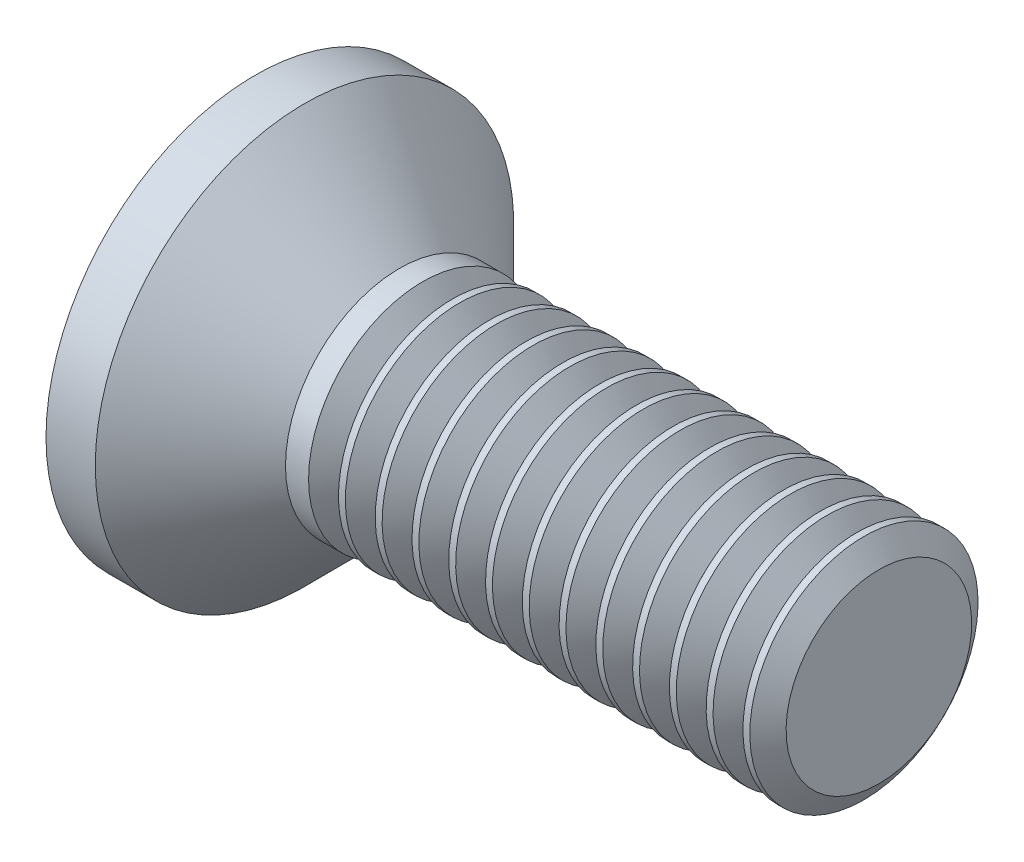
ISO-10303-21;
HEADER;
FILE_DESCRIPTION(('STEP AP214'),'2;1');
FILE_NAME('part.step','',(''),(''),'','','');
FILE_SCHEMA(('AUTOMOTIVE_DESIGN { 1 0 10303 214 1 1 1 1 }'));
ENDSEC;
DATA;
#1=APPLICATION_CONTEXT('core data for automotive mechanical design processes');
#2=APPLICATION_PROTOCOL_DEFINITION('international standard','automotive_design',2000,#1);
#3=PRODUCT_CONTEXT('',#1,'mechanical');
#4=PRODUCT('Part','Part','',(#3));
#5=PRODUCT_RELATED_PRODUCT_CATEGORY('part','',(#4));
#6=PRODUCT_DEFINITION_FORMATION('','',#4);
#7=PRODUCT_DEFINITION_CONTEXT('part definition',#1,'design');
#8=PRODUCT_DEFINITION('design','',#6,#7);
#9=PRODUCT_DEFINITION_SHAPE('','',#8);
#10=(LENGTH_UNIT() NAMED_UNIT(*) SI_UNIT(.MILLI.,.METRE.));
#11=(NAMED_UNIT(*) PLANE_ANGLE_UNIT() SI_UNIT($,.RADIAN.));
#12=(NAMED_UNIT(*) SI_UNIT($,.STERADIAN.) SOLID_ANGLE_UNIT());
#13=UNCERTAINTY_MEASURE_WITH_UNIT(LENGTH_MEASURE(1.E-05),#10,'distance_accuracy_value','');
#14=(GEOMETRIC_REPRESENTATION_CONTEXT(3) GLOBAL_UNCERTAINTY_ASSIGNED_CONTEXT((#13)) GLOBAL_UNIT_ASSIGNED_CONTEXT((#10,
#11,#12)) REPRESENTATION_CONTEXT('',''));
#15=CARTESIAN_POINT('',(0.,0.,0.));
#16=DIRECTION('',(0.,0.,1.));
#17=DIRECTION('',(1.,0.,0.));
#18=AXIS2_PLACEMENT_3D('',#15,#16,#17);
#19=CARTESIAN_POINT('',(7.4,0.,0.));
#20=DIRECTION('',(-1.,0.,0.));
#21=DIRECTION('',(0.,-1.,0.));
#22=AXIS2_PLACEMENT_3D('',#19,#20,#21);
#23=SPHERICAL_SURFACE('',#22,7.4);
#24=CARTESIAN_POINT('',(0.529956332016513,0.,0.));
#25=DIRECTION('',(-1.,0.,0.));
#26=DIRECTION('',(0.,0.,1.));
#27=AXIS2_PLACEMENT_3D('',#24,#25,#26);
#28=CIRCLE('',#27,2.75);
#29=CARTESIAN_POINT('',(0.529956332016513,0.,2.75));
#30=VERTEX_POINT('',#29);
#31=EDGE_CURVE('E158',#30,#30,#28,.T.);
#32=ORIENTED_EDGE('',*,*,#31,.T.);
#33=EDGE_LOOP('',(#32));
#34=FACE_BOUND('',#33,.T.);
#35=CARTESIAN_POINT('',(7.37844022875731,0.,-0.242092852990189));
#36=DIRECTION('',(-0.0887047329662643,0.,-0.996057965356125));
#37=DIRECTION('',(-0.996057965356125,0.,0.0887047329662643));
#38=AXIS2_PLACEMENT_3D('',#35,#36,#37);
#39=CIRCLE('',#38,7.39600745178066);
#40=CARTESIAN_POINT('',(0.185890101969758,1.59933099603895,0.398445409373938));
#41=VERTEX_POINT('',#40);
#42=CARTESIAN_POINT('',(0.0230796751196916,0.41294462120715,0.412944621207152));
#43=VERTEX_POINT('',#42);
#44=EDGE_CURVE('E129',#41,#43,#39,.F.);
#45=ORIENTED_EDGE('',*,*,#44,.T.);
#46=CARTESIAN_POINT('',(7.37844022875731,-0.24209285299019,0.));
#47=DIRECTION('',(-0.0887047329662644,-0.996057965356125,0.));
#48=DIRECTION('',(0.996057965356125,-0.0887047329662644,0.));
#49=AXIS2_PLACEMENT_3D('',#46,#47,#48);
#50=CIRCLE('',#49,7.39600745178066);
#51=CARTESIAN_POINT('',(0.185890101969758,0.398445409373932,1.59933099603895));
#52=VERTEX_POINT('',#51);
#53=EDGE_CURVE('E111',#43,#52,#50,.F.);
#54=ORIENTED_EDGE('',*,*,#53,.T.);
#55=CARTESIAN_POINT('',(5.99170841267437,0.,-2.16946737088841));
#56=DIRECTION('',(0.544482116778557,0.,0.838772450971264));
#57=DIRECTION('',(0.838772450971265,0.,-0.544482116778557));
#58=AXIS2_PLACEMENT_3D('',#55,#56,#57);
#59=CIRCLE('',#58,6.93326230080172);
#60=CARTESIAN_POINT('',(0.185890101969758,-0.398445409373943,1.59933099603894));
#61=VERTEX_POINT('',#60);
#62=EDGE_CURVE('E122',#61,#52,#59,.F.);
#63=ORIENTED_EDGE('',*,*,#62,.F.);
#64=CARTESIAN_POINT('',(7.37844022875731,0.242092852990189,0.));
#65=DIRECTION('',(-0.0887047329662643,0.996057965356125,0.));
#66=DIRECTION('',(-0.996057965356125,-0.0887047329662643,0.));
#67=AXIS2_PLACEMENT_3D('',#64,#65,#66);
#68=CIRCLE('',#67,7.39600745178066);
#69=CARTESIAN_POINT('',(0.0230796751196933,-0.412944621207153,0.412944621207151));
#70=VERTEX_POINT('',#69);
#71=EDGE_CURVE('E188',#61,#70,#68,.F.);
#72=ORIENTED_EDGE('',*,*,#71,.T.);
#73=CARTESIAN_POINT('',(0.185890101969757,-1.59933099603895,0.398445409373938));
#74=VERTEX_POINT('',#73);
#75=EDGE_CURVE('E163',#70,#74,#39,.F.);
#76=ORIENTED_EDGE('',*,*,#75,.T.);
#77=CARTESIAN_POINT('',(5.99170841267437,2.1694673708884,0.));
#78=DIRECTION('',(0.544482116778557,-0.838772450971264,0.));
#79=DIRECTION('',(0.838772450971265,0.544482116778557,0.));
#80=AXIS2_PLACEMENT_3D('',#77,#78,#79);
#81=CIRCLE('',#80,6.93326230080172);
#82=CARTESIAN_POINT('',(0.185890101969757,-1.59933099603895,-0.398445409373938));
#83=VERTEX_POINT('',#82);
#84=EDGE_CURVE('E161',#83,#74,#81,.F.);
#85=ORIENTED_EDGE('',*,*,#84,.F.);
#86=CARTESIAN_POINT('',(7.37844022875731,0.,0.24209285299019));
#87=DIRECTION('',(-0.0887047329662644,0.,0.996057965356125));
#88=DIRECTION('',(0.996057965356125,0.,0.0887047329662644));
#89=AXIS2_PLACEMENT_3D('',#86,#87,#88);
#90=CIRCLE('',#89,7.39600745178066);
#91=CARTESIAN_POINT('',(0.0230796751196933,-0.41294462120715,-0.412944621207152));
#92=VERTEX_POINT('',#91);
#93=EDGE_CURVE('E165',#83,#92,#90,.F.);
#94=ORIENTED_EDGE('',*,*,#93,.T.);
#95=CARTESIAN_POINT('',(0.185890101969757,-0.398445409373932,-1.59933099603895));
#96=VERTEX_POINT('',#95);
#97=EDGE_CURVE('E192',#92,#96,#68,.F.);
#98=ORIENTED_EDGE('',*,*,#97,.T.);
#99=CARTESIAN_POINT('',(5.99170841267437,0.,2.16946737088841));
#100=DIRECTION('',(0.544482116778557,0.,-0.838772450971264));
#101=DIRECTION('',(-0.838772450971265,0.,-0.544482116778557));
#102=AXIS2_PLACEMENT_3D('',#99,#100,#101);
#103=CIRCLE('',#102,6.93326230080172);
#104=CARTESIAN_POINT('',(0.185890101969757,0.398445409373944,-1.59933099603894));
#105=VERTEX_POINT('',#104);
#106=EDGE_CURVE('E123',#105,#96,#103,.F.);
#107=ORIENTED_EDGE('',*,*,#106,.F.);
#108=CARTESIAN_POINT('',(0.0230796751196933,0.412944621207153,-0.412944621207152));
#109=VERTEX_POINT('',#108);
#110=EDGE_CURVE('E148',#105,#109,#50,.F.);
#111=ORIENTED_EDGE('',*,*,#110,.T.);
#112=CARTESIAN_POINT('',(0.185890101969758,1.59933099603895,-0.398445409373938));
#113=VERTEX_POINT('',#112);
#114=EDGE_CURVE('E62',#109,#113,#90,.F.);
#115=ORIENTED_EDGE('',*,*,#114,.T.);
#116=CARTESIAN_POINT('',(5.99170841267437,-2.1694673708884,0.));
#117=DIRECTION('',(0.544482116778557,0.838772450971264,0.));
#118=DIRECTION('',(-0.838772450971265,0.544482116778557,0.));
#119=AXIS2_PLACEMENT_3D('',#116,#117,#118);
#120=CIRCLE('',#119,6.93326230080172);
#121=EDGE_CURVE('E47',#41,#113,#120,.F.);
#122=ORIENTED_EDGE('',*,*,#121,.F.);
#123=EDGE_LOOP('',(#45,#54,#63,#72,#76,#85,#94,#98,#107,#111,#115,#122));
#124=FACE_BOUND('',#123,.T.);
#125=ADVANCED_FACE('F39',(#34,#124),#23,.T.);
#126=CARTESIAN_POINT('',(2.64965289256198,0.,-0.17903305785124));
#127=DIRECTION('',(-0.0887047329662644,0.,0.996057965356125));
#128=DIRECTION('',(0.996057965356125,0.,0.0887047329662644));
#129=AXIS2_PLACEMENT_3D('',#126,#127,#128);
#130=PLANE('',#129);
#131=ORIENTED_EDGE('',*,*,#114,.F.);
#132=DIRECTION('',(0.992162185069946,-0.0883577911596629,0.0883577911596626));
#133=VECTOR('',#132,1.);
#134=CARTESIAN_POINT('',(2.66534787197402,0.177635328998022,-0.177635328998022));
#135=LINE('',#134,#133);
#136=CARTESIAN_POINT('',(2.33,0.207500000000001,-0.207499999999999));
#137=VERTEX_POINT('',#136);
#138=EDGE_CURVE('E170',#109,#137,#135,.T.);
#139=ORIENTED_EDGE('',*,*,#138,.T.);
#140=DIRECTION('',(0.836442139156631,-0.542969414366697,0.0744900188304725));
#141=VECTOR('',#140,1.);
#142=CARTESIAN_POINT('',(0.,1.72,-0.415));
#143=LINE('',#142,#141);
#144=EDGE_CURVE('E132',#113,#137,#143,.T.);
#145=ORIENTED_EDGE('',*,*,#144,.F.);
#146=EDGE_LOOP('',(#131,#139,#145));
#147=FACE_BOUND('',#146,.T.);
#148=ADVANCED_FACE('F169',(#147),#130,.T.);
#149=DIRECTION('',(0.836442139156631,0.542969414366697,0.0744900188304725));
#150=VECTOR('',#149,1.);
#151=CARTESIAN_POINT('',(0.,-1.72,-0.415));
#152=LINE('',#151,#150);
#153=CARTESIAN_POINT('',(2.33,-0.2075,-0.2075));
#154=VERTEX_POINT('',#153);
#155=EDGE_CURVE('E54',#83,#154,#152,.T.);
#156=ORIENTED_EDGE('',*,*,#155,.T.);
#157=DIRECTION('',(-0.992162185069946,-0.0883577911596622,-0.0883577911596626));
#158=VECTOR('',#157,1.);
#159=CARTESIAN_POINT('',(2.66534787197402,-0.177635328998021,-0.177635328998022));
#160=LINE('',#159,#158);
#161=EDGE_CURVE('E190',#154,#92,#160,.T.);
#162=ORIENTED_EDGE('',*,*,#161,.T.);
#163=ORIENTED_EDGE('',*,*,#93,.F.);
#164=EDGE_LOOP('',(#156,#162,#163));
#165=FACE_BOUND('',#164,.T.);
#166=ADVANCED_FACE('F341',(#165),#130,.T.);
#167=CARTESIAN_POINT('',(2.64965289256198,0.,0.17903305785124));
#168=DIRECTION('',(-0.0887047329662643,0.,-0.996057965356125));
#169=DIRECTION('',(-0.996057965356125,0.,0.0887047329662643));
#170=AXIS2_PLACEMENT_3D('',#167,#168,#169);
#171=PLANE('',#170);
#172=DIRECTION('',(0.836442139156631,-0.542969414366697,-0.0744900188304725));
#173=VECTOR('',#172,1.);
#174=CARTESIAN_POINT('',(0.,1.72,0.415));
#175=LINE('',#174,#173);
#176=CARTESIAN_POINT('',(2.33,0.207499999999999,0.207500000000001));
#177=VERTEX_POINT('',#176);
#178=EDGE_CURVE('E127',#41,#177,#175,.T.);
#179=ORIENTED_EDGE('',*,*,#178,.T.);
#180=DIRECTION('',(-0.992162185069947,0.0883577911596623,0.0883577911596626));
#181=VECTOR('',#180,1.);
#182=CARTESIAN_POINT('',(2.66534787197402,0.177635328998021,0.177635328998022));
#183=LINE('',#182,#181);
#184=EDGE_CURVE('E11',#177,#43,#183,.T.);
#185=ORIENTED_EDGE('',*,*,#184,.T.);
#186=ORIENTED_EDGE('',*,*,#44,.F.);
#187=EDGE_LOOP('',(#179,#185,#186));
#188=FACE_BOUND('',#187,.T.);
#189=ADVANCED_FACE('F128',(#188),#171,.T.);
#190=ORIENTED_EDGE('',*,*,#75,.F.);
#191=DIRECTION('',(0.992162185069946,0.0883577911596628,-0.0883577911596625));
#192=VECTOR('',#191,1.);
#193=CARTESIAN_POINT('',(2.66534787197402,-0.177635328998022,0.177635328998022));
#194=LINE('',#193,#192);
#195=CARTESIAN_POINT('',(2.33,-0.2075,0.2075));
#196=VERTEX_POINT('',#195);
#197=EDGE_CURVE('E185',#70,#196,#194,.T.);
#198=ORIENTED_EDGE('',*,*,#197,.T.);
#199=DIRECTION('',(0.836442139156631,0.542969414366697,-0.0744900188304724));
#200=VECTOR('',#199,1.);
#201=CARTESIAN_POINT('',(0.,-1.72,0.415));
#202=LINE('',#201,#200);
#203=EDGE_CURVE('E176',#74,#196,#202,.T.);
#204=ORIENTED_EDGE('',*,*,#203,.F.);
#205=EDGE_LOOP('',(#190,#198,#204));
#206=FACE_BOUND('',#205,.T.);
#207=ADVANCED_FACE('F184',(#206),#171,.T.);
#208=CARTESIAN_POINT('',(-15.875,0.,0.));
#209=DIRECTION('',(-1.,0.,0.));
#210=DIRECTION('',(0.,0.,1.));
#211=AXIS2_PLACEMENT_3D('',#208,#209,#210);
#212=CYLINDRICAL_SURFACE('',#211,2.75);
#213=ORIENTED_EDGE('',*,*,#31,.F.);
#214=EDGE_LOOP('',(#213));
#215=FACE_BOUND('',#214,.T.);
#216=CARTESIAN_POINT('',(1.1776690729551,0.,0.));
#217=DIRECTION('',(-1.,0.,0.));
#218=DIRECTION('',(0.,0.,1.));
#219=AXIS2_PLACEMENT_3D('',#216,#217,#218);
#220=CIRCLE('',#219,2.75);
#221=CARTESIAN_POINT('',(1.1776690729551,0.,2.75));
#222=VERTEX_POINT('',#221);
#223=EDGE_CURVE('E155',#222,#222,#220,.T.);
#224=ORIENTED_EDGE('',*,*,#223,.T.);
#225=EDGE_LOOP('',(#224));
#226=FACE_BOUND('',#225,.T.);
#227=ADVANCED_FACE('F344',(#215,#226),#212,.T.);
#228=CARTESIAN_POINT('',(2.42766907295509,0.,0.));
#229=DIRECTION('',(-1.,0.,0.));
#230=DIRECTION('',(0.,0.,1.));
#231=AXIS2_PLACEMENT_3D('',#228,#229,#230);
#232=CONICAL_SURFACE('',#231,1.5,0.785398163397451);
#233=ORIENTED_EDGE('',*,*,#223,.F.);
#234=EDGE_LOOP('',(#233));
#235=FACE_BOUND('',#234,.T.);
#236=CARTESIAN_POINT('',(2.42766907295509,0.,0.));
#237=DIRECTION('',(-1.,0.,0.));
#238=DIRECTION('',(0.,0.,1.));
#239=AXIS2_PLACEMENT_3D('',#236,#237,#238);
#240=CIRCLE('',#239,1.5);
#241=CARTESIAN_POINT('',(2.42766907295509,0.,1.5));
#242=VERTEX_POINT('',#241);
#243=EDGE_CURVE('E152',#242,#242,#240,.T.);
#244=ORIENTED_EDGE('',*,*,#243,.T.);
#245=EDGE_LOOP('',(#244));
#246=FACE_BOUND('',#245,.T.);
#247=ADVANCED_FACE('F347',(#235,#246),#232,.T.);
#248=CARTESIAN_POINT('',(-15.875,0.,0.));
#249=DIRECTION('',(-1.,0.,0.));
#250=DIRECTION('',(0.,0.,1.));
#251=AXIS2_PLACEMENT_3D('',#248,#249,#250);
#252=CYLINDRICAL_SURFACE('',#251,1.5);
#253=CARTESIAN_POINT('',(2.73126085848727,0.,0.));
#254=DIRECTION('',(-1.,0.,0.));
#255=DIRECTION('',(0.,-1.,0.));
#256=AXIS2_PLACEMENT_3D('',#253,#254,#255);
#257=CIRCLE('',#256,1.5);
#258=CARTESIAN_POINT('',(2.73126085848727,-1.5,0.));
#259=VERTEX_POINT('',#258);
#260=EDGE_CURVE('E214',#259,#259,#257,.T.);
#261=ORIENTED_EDGE('',*,*,#260,.T.);
#262=EDGE_LOOP('',(#261));
#263=FACE_BOUND('',#262,.T.);
#264=ORIENTED_EDGE('',*,*,#243,.F.);
#265=EDGE_LOOP('',(#264));
#266=FACE_BOUND('',#265,.T.);
#267=ADVANCED_FACE('F350',(#263,#266),#252,.T.);
#268=CARTESIAN_POINT('',(2.33,0.2075,-0.2075));
#269=DIRECTION('',(-1.,0.,0.));
#270=DIRECTION('',(0.,0.,1.));
#271=AXIS2_PLACEMENT_3D('',#268,#269,#270);
#272=PLANE('',#271);
#273=DIRECTION('',(0.,1.,0.));
#274=VECTOR('',#273,1.);
#275=CARTESIAN_POINT('',(2.33,-0.2075,-0.2075));
#276=LINE('',#275,#274);
#277=EDGE_CURVE('E145',#154,#137,#276,.T.);
#278=ORIENTED_EDGE('',*,*,#277,.F.);
#279=DIRECTION('',(0.,0.,1.));
#280=VECTOR('',#279,1.);
#281=CARTESIAN_POINT('',(2.33,-0.2075,-0.2075));
#282=LINE('',#281,#280);
#283=EDGE_CURVE('E140',#154,#196,#282,.T.);
#284=ORIENTED_EDGE('',*,*,#283,.T.);
#285=DIRECTION('',(0.,-1.,0.));
#286=VECTOR('',#285,1.);
#287=CARTESIAN_POINT('',(2.33,0.2075,0.2075));
#288=LINE('',#287,#286);
#289=EDGE_CURVE('E119',#177,#196,#288,.T.);
#290=ORIENTED_EDGE('',*,*,#289,.F.);
#291=DIRECTION('',(0.,0.,-1.));
#292=VECTOR('',#291,1.);
#293=CARTESIAN_POINT('',(2.33,0.2075,0.2075));
#294=LINE('',#293,#292);
#295=EDGE_CURVE('E139',#177,#137,#294,.T.);
#296=ORIENTED_EDGE('',*,*,#295,.T.);
#297=EDGE_LOOP('',(#278,#284,#290,#296));
#298=FACE_BOUND('',#297,.T.);
#299=ADVANCED_FACE('F138',(#298),#272,.T.);
#300=CARTESIAN_POINT('',(2.33,0.2075,0.2075));
#301=DIRECTION('',(0.544482116778557,0.838772450971264,0.));
#302=DIRECTION('',(-0.838772450971265,0.544482116778557,0.));
#303=AXIS2_PLACEMENT_3D('',#300,#301,#302);
#304=PLANE('',#303);
#305=ORIENTED_EDGE('',*,*,#121,.T.);
#306=ORIENTED_EDGE('',*,*,#144,.T.);
#307=ORIENTED_EDGE('',*,*,#295,.F.);
#308=ORIENTED_EDGE('',*,*,#178,.F.);
#309=EDGE_LOOP('',(#305,#306,#307,#308));
#310=FACE_BOUND('',#309,.T.);
#311=ADVANCED_FACE('F143',(#310),#304,.F.);
#312=CARTESIAN_POINT('',(2.33,-0.2075,-0.2075));
#313=DIRECTION('',(0.544482116778557,-0.838772450971264,0.));
#314=DIRECTION('',(0.838772450971265,0.544482116778557,0.));
#315=AXIS2_PLACEMENT_3D('',#312,#313,#314);
#316=PLANE('',#315);
#317=ORIENTED_EDGE('',*,*,#84,.T.);
#318=ORIENTED_EDGE('',*,*,#203,.T.);
#319=ORIENTED_EDGE('',*,*,#283,.F.);
#320=ORIENTED_EDGE('',*,*,#155,.F.);
#321=EDGE_LOOP('',(#317,#318,#319,#320));
#322=FACE_BOUND('',#321,.T.);
#323=ADVANCED_FACE('F179',(#322),#316,.F.);
#324=CARTESIAN_POINT('',(2.64965289256198,0.17903305785124,0.));
#325=DIRECTION('',(-0.0887047329662644,-0.996057965356125,0.));
#326=DIRECTION('',(0.996057965356125,-0.0887047329662644,0.));
#327=AXIS2_PLACEMENT_3D('',#324,#325,#326);
#328=PLANE('',#327);
#329=ORIENTED_EDGE('',*,*,#184,.F.);
#330=DIRECTION('',(0.836442139156631,-0.0744900188304706,-0.542969414366698));
#331=VECTOR('',#330,1.);
#332=CARTESIAN_POINT('',(0.,0.414999999999994,1.72));
#333=LINE('',#332,#331);
#334=EDGE_CURVE('E109',#52,#177,#333,.T.);
#335=ORIENTED_EDGE('',*,*,#334,.F.);
#336=ORIENTED_EDGE('',*,*,#53,.F.);
#337=EDGE_LOOP('',(#329,#335,#336));
#338=FACE_BOUND('',#337,.T.);
#339=ADVANCED_FACE('F108',(#338),#328,.T.);
#340=CARTESIAN_POINT('',(2.64965289256198,-0.17903305785124,0.));
#341=DIRECTION('',(-0.0887047329662643,0.996057965356125,0.));
#342=DIRECTION('',(-0.996057965356125,-0.0887047329662643,0.));
#343=AXIS2_PLACEMENT_3D('',#340,#341,#342);
#344=PLANE('',#343);
#345=DIRECTION('',(0.836442139156631,0.0744900188304744,-0.542969414366697));
#346=VECTOR('',#345,1.);
#347=CARTESIAN_POINT('',(0.,-0.415000000000006,1.72));
#348=LINE('',#347,#346);
#349=EDGE_CURVE('E124',#61,#196,#348,.T.);
#350=ORIENTED_EDGE('',*,*,#349,.T.);
#351=ORIENTED_EDGE('',*,*,#197,.F.);
#352=ORIENTED_EDGE('',*,*,#71,.F.);
#353=EDGE_LOOP('',(#350,#351,#352));
#354=FACE_BOUND('',#353,.T.);
#355=ADVANCED_FACE('F368',(#354),#344,.T.);
#356=CARTESIAN_POINT('',(2.33,-0.207500000000001,0.207499999999999));
#357=DIRECTION('',(0.544482116778557,0.,0.838772450971264));
#358=DIRECTION('',(-0.838772450971265,0.,0.544482116778557));
#359=AXIS2_PLACEMENT_3D('',#356,#357,#358);
#360=PLANE('',#359);
#361=ORIENTED_EDGE('',*,*,#62,.T.);
#362=ORIENTED_EDGE('',*,*,#334,.T.);
#363=ORIENTED_EDGE('',*,*,#289,.T.);
#364=ORIENTED_EDGE('',*,*,#349,.F.);
#365=EDGE_LOOP('',(#361,#362,#363,#364));
#366=FACE_BOUND('',#365,.T.);
#367=ADVANCED_FACE('F116',(#366),#360,.F.);
#368=DIRECTION('',(0.836442139156631,-0.0744900188304744,0.542969414366697));
#369=VECTOR('',#368,1.);
#370=CARTESIAN_POINT('',(0.,0.415000000000006,-1.72));
#371=LINE('',#370,#369);
#372=EDGE_CURVE('E203',#105,#137,#371,.T.);
#373=ORIENTED_EDGE('',*,*,#372,.T.);
#374=ORIENTED_EDGE('',*,*,#138,.F.);
#375=ORIENTED_EDGE('',*,*,#110,.F.);
#376=EDGE_LOOP('',(#373,#374,#375));
#377=FACE_BOUND('',#376,.T.);
#378=ADVANCED_FACE('F202',(#377),#328,.T.);
#379=ORIENTED_EDGE('',*,*,#161,.F.);
#380=DIRECTION('',(0.836442139156631,0.0744900188304705,0.542969414366698));
#381=VECTOR('',#380,1.);
#382=CARTESIAN_POINT('',(0.,-0.414999999999994,-1.72));
#383=LINE('',#382,#381);
#384=EDGE_CURVE('E207',#96,#154,#383,.T.);
#385=ORIENTED_EDGE('',*,*,#384,.F.);
#386=ORIENTED_EDGE('',*,*,#97,.F.);
#387=EDGE_LOOP('',(#379,#385,#386));
#388=FACE_BOUND('',#387,.T.);
#389=ADVANCED_FACE('F367',(#388),#344,.T.);
#390=CARTESIAN_POINT('',(2.33,0.207500000000001,-0.207499999999999));
#391=DIRECTION('',(0.544482116778557,0.,-0.838772450971264));
#392=DIRECTION('',(0.838772450971265,0.,0.544482116778557));
#393=AXIS2_PLACEMENT_3D('',#390,#391,#392);
#394=PLANE('',#393);
#395=ORIENTED_EDGE('',*,*,#106,.T.);
#396=ORIENTED_EDGE('',*,*,#384,.T.);
#397=ORIENTED_EDGE('',*,*,#277,.T.);
#398=ORIENTED_EDGE('',*,*,#372,.F.);
#399=EDGE_LOOP('',(#395,#396,#397,#398));
#400=FACE_BOUND('',#399,.T.);
#401=ADVANCED_FACE('F205',(#400),#394,.F.);
#402=CARTESIAN_POINT('',(3.12407728742291,0.,0.));
#403=DIRECTION('',(1.,0.,0.));
#404=DIRECTION('',(0.,1.,0.));
#405=AXIS2_PLACEMENT_3D('',#402,#403,#404);
#406=CONICAL_SURFACE('',#405,1.5,0.959931088596885);
#407=CARTESIAN_POINT('',(2.92766907295509,0.,0.));
#408=DIRECTION('',(-1.,0.,0.));
#409=DIRECTION('',(0.,-1.,0.));
#410=AXIS2_PLACEMENT_3D('',#407,#408,#409);
#411=CIRCLE('',#410,1.2195);
#412=CARTESIAN_POINT('',(2.92766907295509,-1.2195,0.));
#413=VERTEX_POINT('',#412);
#414=EDGE_CURVE('E217',#413,#413,#411,.T.);
#415=ORIENTED_EDGE('',*,*,#414,.F.);
#416=EDGE_LOOP('',(#415));
#417=FACE_BOUND('',#416,.T.);
#418=CARTESIAN_POINT('',(3.12407728742291,0.,0.));
#419=DIRECTION('',(-1.,0.,0.));
#420=DIRECTION('',(0.,-1.,0.));
#421=AXIS2_PLACEMENT_3D('',#418,#419,#420);
#422=CIRCLE('',#421,1.5);
#423=CARTESIAN_POINT('',(3.12407728742291,-1.5,0.));
#424=VERTEX_POINT('',#423);
#425=EDGE_CURVE('E210',#424,#424,#422,.T.);
#426=ORIENTED_EDGE('',*,*,#425,.T.);
#427=EDGE_LOOP('',(#426));
#428=FACE_BOUND('',#427,.T.);
#429=ADVANCED_FACE('F366',(#417,#428),#406,.T.);
#430=CARTESIAN_POINT('',(2.92766907295509,0.,0.));
#431=DIRECTION('',(-1.,0.,0.));
#432=DIRECTION('',(0.,-1.,0.));
#433=AXIS2_PLACEMENT_3D('',#430,#431,#432);
#434=CONICAL_SURFACE('',#433,1.2195,0.959931088596876);
#435=ORIENTED_EDGE('',*,*,#260,.F.);
#436=EDGE_LOOP('',(#435));
#437=FACE_BOUND('',#436,.T.);
#438=ORIENTED_EDGE('',*,*,#414,.T.);
#439=EDGE_LOOP('',(#438));
#440=FACE_BOUND('',#439,.T.);
#441=ADVANCED_FACE('F377',(#437,#440),#434,.T.);
#442=CARTESIAN_POINT('',(3.2145941918206,0.,0.));
#443=DIRECTION('',(-1.,0.,0.));
#444=DIRECTION('',(0.,-1.,0.));
#445=AXIS2_PLACEMENT_3D('',#442,#443,#444);
#446=CIRCLE('',#445,1.5);
#447=CARTESIAN_POINT('',(3.2145941918206,-1.5,0.));
#448=VERTEX_POINT('',#447);
#449=EDGE_CURVE('E223',#448,#448,#446,.T.);
#450=ORIENTED_EDGE('',*,*,#449,.T.);
#451=EDGE_LOOP('',(#450));
#452=FACE_BOUND('',#451,.T.);
#453=ORIENTED_EDGE('',*,*,#425,.F.);
#454=EDGE_LOOP('',(#453));
#455=FACE_BOUND('',#454,.T.);
#456=ADVANCED_FACE('F355',(#452,#455),#252,.T.);
#457=CARTESIAN_POINT('',(3.60741062075625,0.,0.));
#458=DIRECTION('',(1.,0.,0.));
#459=DIRECTION('',(0.,1.,0.));
#460=AXIS2_PLACEMENT_3D('',#457,#458,#459);
#461=CONICAL_SURFACE('',#460,1.5,0.959931088596885);
#462=CARTESIAN_POINT('',(3.41100240628842,0.,0.));
#463=DIRECTION('',(-1.,0.,0.));
#464=DIRECTION('',(0.,-1.,0.));
#465=AXIS2_PLACEMENT_3D('',#462,#463,#464);
#466=CIRCLE('',#465,1.2195);
#467=CARTESIAN_POINT('',(3.41100240628842,-1.2195,0.));
#468=VERTEX_POINT('',#467);
#469=EDGE_CURVE('E226',#468,#468,#466,.T.);
#470=ORIENTED_EDGE('',*,*,#469,.F.);
#471=EDGE_LOOP('',(#470));
#472=FACE_BOUND('',#471,.T.);
#473=CARTESIAN_POINT('',(3.60741062075625,0.,0.));
#474=DIRECTION('',(-1.,0.,0.));
#475=DIRECTION('',(0.,-1.,0.));
#476=AXIS2_PLACEMENT_3D('',#473,#474,#475);
#477=CIRCLE('',#476,1.5);
#478=CARTESIAN_POINT('',(3.60741062075625,-1.5,0.));
#479=VERTEX_POINT('',#478);
#480=EDGE_CURVE('E220',#479,#479,#477,.T.);
#481=ORIENTED_EDGE('',*,*,#480,.T.);
#482=EDGE_LOOP('',(#481));
#483=FACE_BOUND('',#482,.T.);
#484=ADVANCED_FACE('F382',(#472,#483),#461,.T.);
#485=CARTESIAN_POINT('',(3.41100240628842,0.,0.));
#486=DIRECTION('',(-1.,0.,0.));
#487=DIRECTION('',(0.,-1.,0.));
#488=AXIS2_PLACEMENT_3D('',#485,#486,#487);
#489=CONICAL_SURFACE('',#488,1.2195,0.959931088596876);
#490=ORIENTED_EDGE('',*,*,#449,.F.);
#491=EDGE_LOOP('',(#490));
#492=FACE_BOUND('',#491,.T.);
#493=ORIENTED_EDGE('',*,*,#469,.T.);
#494=EDGE_LOOP('',(#493));
#495=FACE_BOUND('',#494,.T.);
#496=ADVANCED_FACE('F385',(#492,#495),#489,.T.);
#497=CARTESIAN_POINT('',(3.69792752515393,0.,0.));
#498=DIRECTION('',(-1.,0.,0.));
#499=DIRECTION('',(0.,-1.,0.));
#500=AXIS2_PLACEMENT_3D('',#497,#498,#499);
#501=CIRCLE('',#500,1.5);
#502=CARTESIAN_POINT('',(3.69792752515393,-1.5,0.));
#503=VERTEX_POINT('',#502);
#504=EDGE_CURVE('E232',#503,#503,#501,.T.);
#505=ORIENTED_EDGE('',*,*,#504,.T.);
#506=EDGE_LOOP('',(#505));
#507=FACE_BOUND('',#506,.T.);
#508=ORIENTED_EDGE('',*,*,#480,.F.);
#509=EDGE_LOOP('',(#508));
#510=FACE_BOUND('',#509,.T.);
#511=ADVANCED_FACE('F389',(#507,#510),#252,.T.);
#512=CARTESIAN_POINT('',(4.09074395408958,0.,0.));
#513=DIRECTION('',(1.,0.,0.));
#514=DIRECTION('',(0.,1.,0.));
#515=AXIS2_PLACEMENT_3D('',#512,#513,#514);
#516=CONICAL_SURFACE('',#515,1.5,0.959931088596885);
#517=CARTESIAN_POINT('',(3.89433573962176,0.,0.));
#518=DIRECTION('',(-1.,0.,0.));
#519=DIRECTION('',(0.,-1.,0.));
#520=AXIS2_PLACEMENT_3D('',#517,#518,#519);
#521=CIRCLE('',#520,1.2195);
#522=CARTESIAN_POINT('',(3.89433573962176,-1.2195,0.));
#523=VERTEX_POINT('',#522);
#524=EDGE_CURVE('E235',#523,#523,#521,.T.);
#525=ORIENTED_EDGE('',*,*,#524,.F.);
#526=EDGE_LOOP('',(#525));
#527=FACE_BOUND('',#526,.T.);
#528=CARTESIAN_POINT('',(4.09074395408958,0.,0.));
#529=DIRECTION('',(-1.,0.,0.));
#530=DIRECTION('',(0.,-1.,0.));
#531=AXIS2_PLACEMENT_3D('',#528,#529,#530);
#532=CIRCLE('',#531,1.5);
#533=CARTESIAN_POINT('',(4.09074395408958,-1.5,0.));
#534=VERTEX_POINT('',#533);
#535=EDGE_CURVE('E229',#534,#534,#532,.T.);
#536=ORIENTED_EDGE('',*,*,#535,.T.);
#537=EDGE_LOOP('',(#536));
#538=FACE_BOUND('',#537,.T.);
#539=ADVANCED_FACE('F391',(#527,#538),#516,.T.);
#540=CARTESIAN_POINT('',(3.89433573962176,0.,0.));
#541=DIRECTION('',(-1.,0.,0.));
#542=DIRECTION('',(0.,-1.,0.));
#543=AXIS2_PLACEMENT_3D('',#540,#541,#542);
#544=CONICAL_SURFACE('',#543,1.2195,0.959931088596876);
#545=ORIENTED_EDGE('',*,*,#504,.F.);
#546=EDGE_LOOP('',(#545));
#547=FACE_BOUND('',#546,.T.);
#548=ORIENTED_EDGE('',*,*,#524,.T.);
#549=EDGE_LOOP('',(#548));
#550=FACE_BOUND('',#549,.T.);
#551=ADVANCED_FACE('F394',(#547,#550),#544,.T.);
#552=CARTESIAN_POINT('',(4.18126085848726,0.,0.));
#553=DIRECTION('',(-1.,0.,0.));
#554=DIRECTION('',(0.,-1.,0.));
#555=AXIS2_PLACEMENT_3D('',#552,#553,#554);
#556=CIRCLE('',#555,1.5);
#557=CARTESIAN_POINT('',(4.18126085848726,-1.5,0.));
#558=VERTEX_POINT('',#557);
#559=EDGE_CURVE('E241',#558,#558,#556,.T.);
#560=ORIENTED_EDGE('',*,*,#559,.T.);
#561=EDGE_LOOP('',(#560));
#562=FACE_BOUND('',#561,.T.);
#563=ORIENTED_EDGE('',*,*,#535,.F.);
#564=EDGE_LOOP('',(#563));
#565=FACE_BOUND('',#564,.T.);
#566=ADVANCED_FACE('F398',(#562,#565),#252,.T.);
#567=CARTESIAN_POINT('',(4.57407728742291,0.,0.));
#568=DIRECTION('',(1.,0.,0.));
#569=DIRECTION('',(0.,1.,0.));
#570=AXIS2_PLACEMENT_3D('',#567,#568,#569);
#571=CONICAL_SURFACE('',#570,1.5,0.959931088596885);
#572=CARTESIAN_POINT('',(4.37766907295509,0.,0.));
#573=DIRECTION('',(-1.,0.,0.));
#574=DIRECTION('',(0.,-1.,0.));
#575=AXIS2_PLACEMENT_3D('',#572,#573,#574);
#576=CIRCLE('',#575,1.2195);
#577=CARTESIAN_POINT('',(4.37766907295509,-1.2195,0.));
#578=VERTEX_POINT('',#577);
#579=EDGE_CURVE('E244',#578,#578,#576,.T.);
#580=ORIENTED_EDGE('',*,*,#579,.F.);
#581=EDGE_LOOP('',(#580));
#582=FACE_BOUND('',#581,.T.);
#583=CARTESIAN_POINT('',(4.57407728742291,0.,0.));
#584=DIRECTION('',(-1.,0.,0.));
#585=DIRECTION('',(0.,-1.,0.));
#586=AXIS2_PLACEMENT_3D('',#583,#584,#585);
#587=CIRCLE('',#586,1.5);
#588=CARTESIAN_POINT('',(4.57407728742291,-1.5,0.));
#589=VERTEX_POINT('',#588);
#590=EDGE_CURVE('E238',#589,#589,#587,.T.);
#591=ORIENTED_EDGE('',*,*,#590,.T.);
#592=EDGE_LOOP('',(#591));
#593=FACE_BOUND('',#592,.T.);
#594=ADVANCED_FACE('F400',(#582,#593),#571,.T.);
#595=CARTESIAN_POINT('',(4.37766907295509,0.,0.));
#596=DIRECTION('',(-1.,0.,0.));
#597=DIRECTION('',(0.,-1.,0.));
#598=AXIS2_PLACEMENT_3D('',#595,#596,#597);
#599=CONICAL_SURFACE('',#598,1.2195,0.959931088596876);
#600=ORIENTED_EDGE('',*,*,#559,.F.);
#601=EDGE_LOOP('',(#600));
#602=FACE_BOUND('',#601,.T.);
#603=ORIENTED_EDGE('',*,*,#579,.T.);
#604=EDGE_LOOP('',(#603));
#605=FACE_BOUND('',#604,.T.);
#606=ADVANCED_FACE('F403',(#602,#605),#599,.T.);
#607=CARTESIAN_POINT('',(4.6645941918206,0.,0.));
#608=DIRECTION('',(-1.,0.,0.));
#609=DIRECTION('',(0.,-1.,0.));
#610=AXIS2_PLACEMENT_3D('',#607,#608,#609);
#611=CIRCLE('',#610,1.5);
#612=CARTESIAN_POINT('',(4.6645941918206,-1.5,0.));
#613=VERTEX_POINT('',#612);
#614=EDGE_CURVE('E250',#613,#613,#611,.T.);
#615=ORIENTED_EDGE('',*,*,#614,.T.);
#616=EDGE_LOOP('',(#615));
#617=FACE_BOUND('',#616,.T.);
#618=ORIENTED_EDGE('',*,*,#590,.F.);
#619=EDGE_LOOP('',(#618));
#620=FACE_BOUND('',#619,.T.);
#621=ADVANCED_FACE('F407',(#617,#620),#252,.T.);
#622=CARTESIAN_POINT('',(5.05741062075625,0.,0.));
#623=DIRECTION('',(1.,0.,0.));
#624=DIRECTION('',(0.,1.,0.));
#625=AXIS2_PLACEMENT_3D('',#622,#623,#624);
#626=CONICAL_SURFACE('',#625,1.5,0.959931088596885);
#627=CARTESIAN_POINT('',(4.86100240628842,0.,0.));
#628=DIRECTION('',(-1.,0.,0.));
#629=DIRECTION('',(0.,-1.,0.));
#630=AXIS2_PLACEMENT_3D('',#627,#628,#629);
#631=CIRCLE('',#630,1.2195);
#632=CARTESIAN_POINT('',(4.86100240628842,-1.2195,0.));
#633=VERTEX_POINT('',#632);
#634=EDGE_CURVE('E253',#633,#633,#631,.T.);
#635=ORIENTED_EDGE('',*,*,#634,.F.);
#636=EDGE_LOOP('',(#635));
#637=FACE_BOUND('',#636,.T.);
#638=CARTESIAN_POINT('',(5.05741062075625,0.,0.));
#639=DIRECTION('',(-1.,0.,0.));
#640=DIRECTION('',(0.,-1.,0.));
#641=AXIS2_PLACEMENT_3D('',#638,#639,#640);
#642=CIRCLE('',#641,1.5);
#643=CARTESIAN_POINT('',(5.05741062075625,-1.5,0.));
#644=VERTEX_POINT('',#643);
#645=EDGE_CURVE('E247',#644,#644,#642,.T.);
#646=ORIENTED_EDGE('',*,*,#645,.T.);
#647=EDGE_LOOP('',(#646));
#648=FACE_BOUND('',#647,.T.);
#649=ADVANCED_FACE('F409',(#637,#648),#626,.T.);
#650=CARTESIAN_POINT('',(4.86100240628842,0.,0.));
#651=DIRECTION('',(-1.,0.,0.));
#652=DIRECTION('',(0.,-1.,0.));
#653=AXIS2_PLACEMENT_3D('',#650,#651,#652);
#654=CONICAL_SURFACE('',#653,1.2195,0.959931088596876);
#655=ORIENTED_EDGE('',*,*,#614,.F.);
#656=EDGE_LOOP('',(#655));
#657=FACE_BOUND('',#656,.T.);
#658=ORIENTED_EDGE('',*,*,#634,.T.);
#659=EDGE_LOOP('',(#658));
#660=FACE_BOUND('',#659,.T.);
#661=ADVANCED_FACE('F412',(#657,#660),#654,.T.);
#662=CARTESIAN_POINT('',(5.14792752515393,0.,0.));
#663=DIRECTION('',(-1.,0.,0.));
#664=DIRECTION('',(0.,-1.,0.));
#665=AXIS2_PLACEMENT_3D('',#662,#663,#664);
#666=CIRCLE('',#665,1.5);
#667=CARTESIAN_POINT('',(5.14792752515393,-1.5,0.));
#668=VERTEX_POINT('',#667);
#669=EDGE_CURVE('E259',#668,#668,#666,.T.);
#670=ORIENTED_EDGE('',*,*,#669,.T.);
#671=EDGE_LOOP('',(#670));
#672=FACE_BOUND('',#671,.T.);
#673=ORIENTED_EDGE('',*,*,#645,.F.);
#674=EDGE_LOOP('',(#673));
#675=FACE_BOUND('',#674,.T.);
#676=ADVANCED_FACE('F416',(#672,#675),#252,.T.);
#677=CARTESIAN_POINT('',(5.54074395408958,0.,0.));
#678=DIRECTION('',(1.,0.,0.));
#679=DIRECTION('',(0.,1.,0.));
#680=AXIS2_PLACEMENT_3D('',#677,#678,#679);
#681=CONICAL_SURFACE('',#680,1.5,0.959931088596885);
#682=CARTESIAN_POINT('',(5.34433573962176,0.,0.));
#683=DIRECTION('',(-1.,0.,0.));
#684=DIRECTION('',(0.,-1.,0.));
#685=AXIS2_PLACEMENT_3D('',#682,#683,#684);
#686=CIRCLE('',#685,1.2195);
#687=CARTESIAN_POINT('',(5.34433573962176,-1.2195,0.));
#688=VERTEX_POINT('',#687);
#689=EDGE_CURVE('E262',#688,#688,#686,.T.);
#690=ORIENTED_EDGE('',*,*,#689,.F.);
#691=EDGE_LOOP('',(#690));
#692=FACE_BOUND('',#691,.T.);
#693=CARTESIAN_POINT('',(5.54074395408958,0.,0.));
#694=DIRECTION('',(-1.,0.,0.));
#695=DIRECTION('',(0.,-1.,0.));
#696=AXIS2_PLACEMENT_3D('',#693,#694,#695);
#697=CIRCLE('',#696,1.5);
#698=CARTESIAN_POINT('',(5.54074395408958,-1.5,0.));
#699=VERTEX_POINT('',#698);
#700=EDGE_CURVE('E256',#699,#699,#697,.T.);
#701=ORIENTED_EDGE('',*,*,#700,.T.);
#702=EDGE_LOOP('',(#701));
#703=FACE_BOUND('',#702,.T.);
#704=ADVANCED_FACE('F418',(#692,#703),#681,.T.);
#705=CARTESIAN_POINT('',(5.34433573962176,0.,0.));
#706=DIRECTION('',(-1.,0.,0.));
#707=DIRECTION('',(0.,-1.,0.));
#708=AXIS2_PLACEMENT_3D('',#705,#706,#707);
#709=CONICAL_SURFACE('',#708,1.2195,0.959931088596876);
#710=ORIENTED_EDGE('',*,*,#669,.F.);
#711=EDGE_LOOP('',(#710));
#712=FACE_BOUND('',#711,.T.);
#713=ORIENTED_EDGE('',*,*,#689,.T.);
#714=EDGE_LOOP('',(#713));
#715=FACE_BOUND('',#714,.T.);
#716=ADVANCED_FACE('F421',(#712,#715),#709,.T.);
#717=CARTESIAN_POINT('',(5.63126085848726,0.,0.));
#718=DIRECTION('',(-1.,0.,0.));
#719=DIRECTION('',(0.,-1.,0.));
#720=AXIS2_PLACEMENT_3D('',#717,#718,#719);
#721=CIRCLE('',#720,1.5);
#722=CARTESIAN_POINT('',(5.63126085848726,-1.5,0.));
#723=VERTEX_POINT('',#722);
#724=EDGE_CURVE('E268',#723,#723,#721,.T.);
#725=ORIENTED_EDGE('',*,*,#724,.T.);
#726=EDGE_LOOP('',(#725));
#727=FACE_BOUND('',#726,.T.);
#728=ORIENTED_EDGE('',*,*,#700,.F.);
#729=EDGE_LOOP('',(#728));
#730=FACE_BOUND('',#729,.T.);
#731=ADVANCED_FACE('F425',(#727,#730),#252,.T.);
#732=CARTESIAN_POINT('',(6.02407728742291,0.,0.));
#733=DIRECTION('',(1.,0.,0.));
#734=DIRECTION('',(0.,1.,0.));
#735=AXIS2_PLACEMENT_3D('',#732,#733,#734);
#736=CONICAL_SURFACE('',#735,1.5,0.959931088596885);
#737=CARTESIAN_POINT('',(5.82766907295509,0.,0.));
#738=DIRECTION('',(-1.,0.,0.));
#739=DIRECTION('',(0.,-1.,0.));
#740=AXIS2_PLACEMENT_3D('',#737,#738,#739);
#741=CIRCLE('',#740,1.2195);
#742=CARTESIAN_POINT('',(5.82766907295509,-1.2195,0.));
#743=VERTEX_POINT('',#742);
#744=EDGE_CURVE('E271',#743,#743,#741,.T.);
#745=ORIENTED_EDGE('',*,*,#744,.F.);
#746=EDGE_LOOP('',(#745));
#747=FACE_BOUND('',#746,.T.);
#748=CARTESIAN_POINT('',(6.02407728742291,0.,0.));
#749=DIRECTION('',(-1.,0.,0.));
#750=DIRECTION('',(0.,-1.,0.));
#751=AXIS2_PLACEMENT_3D('',#748,#749,#750);
#752=CIRCLE('',#751,1.5);
#753=CARTESIAN_POINT('',(6.02407728742291,-1.5,0.));
#754=VERTEX_POINT('',#753);
#755=EDGE_CURVE('E265',#754,#754,#752,.T.);
#756=ORIENTED_EDGE('',*,*,#755,.T.);
#757=EDGE_LOOP('',(#756));
#758=FACE_BOUND('',#757,.T.);
#759=ADVANCED_FACE('F427',(#747,#758),#736,.T.);
#760=CARTESIAN_POINT('',(5.82766907295509,0.,0.));
#761=DIRECTION('',(-1.,0.,0.));
#762=DIRECTION('',(0.,-1.,0.));
#763=AXIS2_PLACEMENT_3D('',#760,#761,#762);
#764=CONICAL_SURFACE('',#763,1.2195,0.959931088596876);
#765=ORIENTED_EDGE('',*,*,#724,.F.);
#766=EDGE_LOOP('',(#765));
#767=FACE_BOUND('',#766,.T.);
#768=ORIENTED_EDGE('',*,*,#744,.T.);
#769=EDGE_LOOP('',(#768));
#770=FACE_BOUND('',#769,.T.);
#771=ADVANCED_FACE('F430',(#767,#770),#764,.T.);
#772=CARTESIAN_POINT('',(6.1145941918206,0.,0.));
#773=DIRECTION('',(-1.,0.,0.));
#774=DIRECTION('',(0.,-1.,0.));
#775=AXIS2_PLACEMENT_3D('',#772,#773,#774);
#776=CIRCLE('',#775,1.5);
#777=CARTESIAN_POINT('',(6.1145941918206,-1.5,0.));
#778=VERTEX_POINT('',#777);
#779=EDGE_CURVE('E277',#778,#778,#776,.T.);
#780=ORIENTED_EDGE('',*,*,#779,.T.);
#781=EDGE_LOOP('',(#780));
#782=FACE_BOUND('',#781,.T.);
#783=ORIENTED_EDGE('',*,*,#755,.F.);
#784=EDGE_LOOP('',(#783));
#785=FACE_BOUND('',#784,.T.);
#786=ADVANCED_FACE('F434',(#782,#785),#252,.T.);
#787=CARTESIAN_POINT('',(6.50741062075625,0.,0.));
#788=DIRECTION('',(1.,0.,0.));
#789=DIRECTION('',(0.,1.,0.));
#790=AXIS2_PLACEMENT_3D('',#787,#788,#789);
#791=CONICAL_SURFACE('',#790,1.5,0.959931088596885);
#792=CARTESIAN_POINT('',(6.31100240628842,0.,0.));
#793=DIRECTION('',(-1.,0.,0.));
#794=DIRECTION('',(0.,-1.,0.));
#795=AXIS2_PLACEMENT_3D('',#792,#793,#794);
#796=CIRCLE('',#795,1.2195);
#797=CARTESIAN_POINT('',(6.31100240628842,-1.2195,0.));
#798=VERTEX_POINT('',#797);
#799=EDGE_CURVE('E280',#798,#798,#796,.T.);
#800=ORIENTED_EDGE('',*,*,#799,.F.);
#801=EDGE_LOOP('',(#800));
#802=FACE_BOUND('',#801,.T.);
#803=CARTESIAN_POINT('',(6.50741062075625,0.,0.));
#804=DIRECTION('',(-1.,0.,0.));
#805=DIRECTION('',(0.,-1.,0.));
#806=AXIS2_PLACEMENT_3D('',#803,#804,#805);
#807=CIRCLE('',#806,1.5);
#808=CARTESIAN_POINT('',(6.50741062075625,-1.5,0.));
#809=VERTEX_POINT('',#808);
#810=EDGE_CURVE('E274',#809,#809,#807,.T.);
#811=ORIENTED_EDGE('',*,*,#810,.T.);
#812=EDGE_LOOP('',(#811));
#813=FACE_BOUND('',#812,.T.);
#814=ADVANCED_FACE('F436',(#802,#813),#791,.T.);
#815=CARTESIAN_POINT('',(6.31100240628842,0.,0.));
#816=DIRECTION('',(-1.,0.,0.));
#817=DIRECTION('',(0.,-1.,0.));
#818=AXIS2_PLACEMENT_3D('',#815,#816,#817);
#819=CONICAL_SURFACE('',#818,1.2195,0.959931088596876);
#820=ORIENTED_EDGE('',*,*,#779,.F.);
#821=EDGE_LOOP('',(#820));
#822=FACE_BOUND('',#821,.T.);
#823=ORIENTED_EDGE('',*,*,#799,.T.);
#824=EDGE_LOOP('',(#823));
#825=FACE_BOUND('',#824,.T.);
#826=ADVANCED_FACE('F439',(#822,#825),#819,.T.);
#827=CARTESIAN_POINT('',(6.59792752515393,0.,0.));
#828=DIRECTION('',(-1.,0.,0.));
#829=DIRECTION('',(0.,-1.,0.));
#830=AXIS2_PLACEMENT_3D('',#827,#828,#829);
#831=CIRCLE('',#830,1.5);
#832=CARTESIAN_POINT('',(6.59792752515393,-1.5,0.));
#833=VERTEX_POINT('',#832);
#834=EDGE_CURVE('E286',#833,#833,#831,.T.);
#835=ORIENTED_EDGE('',*,*,#834,.T.);
#836=EDGE_LOOP('',(#835));
#837=FACE_BOUND('',#836,.T.);
#838=ORIENTED_EDGE('',*,*,#810,.F.);
#839=EDGE_LOOP('',(#838));
#840=FACE_BOUND('',#839,.T.);
#841=ADVANCED_FACE('F443',(#837,#840),#252,.T.);
#842=CARTESIAN_POINT('',(6.99074395408958,0.,0.));
#843=DIRECTION('',(1.,0.,0.));
#844=DIRECTION('',(0.,1.,0.));
#845=AXIS2_PLACEMENT_3D('',#842,#843,#844);
#846=CONICAL_SURFACE('',#845,1.5,0.959931088596885);
#847=CARTESIAN_POINT('',(6.79433573962176,0.,0.));
#848=DIRECTION('',(-1.,0.,0.));
#849=DIRECTION('',(0.,-1.,0.));
#850=AXIS2_PLACEMENT_3D('',#847,#848,#849);
#851=CIRCLE('',#850,1.2195);
#852=CARTESIAN_POINT('',(6.79433573962176,-1.2195,0.));
#853=VERTEX_POINT('',#852);
#854=EDGE_CURVE('E289',#853,#853,#851,.T.);
#855=ORIENTED_EDGE('',*,*,#854,.F.);
#856=EDGE_LOOP('',(#855));
#857=FACE_BOUND('',#856,.T.);
#858=CARTESIAN_POINT('',(6.99074395408958,0.,0.));
#859=DIRECTION('',(-1.,0.,0.));
#860=DIRECTION('',(0.,-1.,0.));
#861=AXIS2_PLACEMENT_3D('',#858,#859,#860);
#862=CIRCLE('',#861,1.5);
#863=CARTESIAN_POINT('',(6.99074395408958,-1.5,0.));
#864=VERTEX_POINT('',#863);
#865=EDGE_CURVE('E283',#864,#864,#862,.T.);
#866=ORIENTED_EDGE('',*,*,#865,.T.);
#867=EDGE_LOOP('',(#866));
#868=FACE_BOUND('',#867,.T.);
#869=ADVANCED_FACE('F445',(#857,#868),#846,.T.);
#870=CARTESIAN_POINT('',(6.79433573962176,0.,0.));
#871=DIRECTION('',(-1.,0.,0.));
#872=DIRECTION('',(0.,-1.,0.));
#873=AXIS2_PLACEMENT_3D('',#870,#871,#872);
#874=CONICAL_SURFACE('',#873,1.2195,0.959931088596876);
#875=ORIENTED_EDGE('',*,*,#834,.F.);
#876=EDGE_LOOP('',(#875));
#877=FACE_BOUND('',#876,.T.);
#878=ORIENTED_EDGE('',*,*,#854,.T.);
#879=EDGE_LOOP('',(#878));
#880=FACE_BOUND('',#879,.T.);
#881=ADVANCED_FACE('F448',(#877,#880),#874,.T.);
#882=CARTESIAN_POINT('',(7.08126085848726,0.,0.));
#883=DIRECTION('',(-1.,0.,0.));
#884=DIRECTION('',(0.,-1.,0.));
#885=AXIS2_PLACEMENT_3D('',#882,#883,#884);
#886=CIRCLE('',#885,1.5);
#887=CARTESIAN_POINT('',(7.08126085848726,-1.5,0.));
#888=VERTEX_POINT('',#887);
#889=EDGE_CURVE('E295',#888,#888,#886,.T.);
#890=ORIENTED_EDGE('',*,*,#889,.T.);
#891=EDGE_LOOP('',(#890));
#892=FACE_BOUND('',#891,.T.);
#893=ORIENTED_EDGE('',*,*,#865,.F.);
#894=EDGE_LOOP('',(#893));
#895=FACE_BOUND('',#894,.T.);
#896=ADVANCED_FACE('F452',(#892,#895),#252,.T.);
#897=CARTESIAN_POINT('',(7.47407728742291,0.,0.));
#898=DIRECTION('',(1.,0.,0.));
#899=DIRECTION('',(0.,1.,0.));
#900=AXIS2_PLACEMENT_3D('',#897,#898,#899);
#901=CONICAL_SURFACE('',#900,1.5,0.959931088596885);
#902=CARTESIAN_POINT('',(7.27766907295509,0.,0.));
#903=DIRECTION('',(-1.,0.,0.));
#904=DIRECTION('',(0.,-1.,0.));
#905=AXIS2_PLACEMENT_3D('',#902,#903,#904);
#906=CIRCLE('',#905,1.2195);
#907=CARTESIAN_POINT('',(7.27766907295509,-1.2195,0.));
#908=VERTEX_POINT('',#907);
#909=EDGE_CURVE('E298',#908,#908,#906,.T.);
#910=ORIENTED_EDGE('',*,*,#909,.F.);
#911=EDGE_LOOP('',(#910));
#912=FACE_BOUND('',#911,.T.);
#913=CARTESIAN_POINT('',(7.47407728742291,0.,0.));
#914=DIRECTION('',(-1.,0.,0.));
#915=DIRECTION('',(0.,-1.,0.));
#916=AXIS2_PLACEMENT_3D('',#913,#914,#915);
#917=CIRCLE('',#916,1.5);
#918=CARTESIAN_POINT('',(7.47407728742291,-1.5,0.));
#919=VERTEX_POINT('',#918);
#920=EDGE_CURVE('E292',#919,#919,#917,.T.);
#921=ORIENTED_EDGE('',*,*,#920,.T.);
#922=EDGE_LOOP('',(#921));
#923=FACE_BOUND('',#922,.T.);
#924=ADVANCED_FACE('F454',(#912,#923),#901,.T.);
#925=CARTESIAN_POINT('',(7.27766907295509,0.,0.));
#926=DIRECTION('',(-1.,0.,0.));
#927=DIRECTION('',(0.,-1.,0.));
#928=AXIS2_PLACEMENT_3D('',#925,#926,#927);
#929=CONICAL_SURFACE('',#928,1.2195,0.959931088596876);
#930=ORIENTED_EDGE('',*,*,#889,.F.);
#931=EDGE_LOOP('',(#930));
#932=FACE_BOUND('',#931,.T.);
#933=ORIENTED_EDGE('',*,*,#909,.T.);
#934=EDGE_LOOP('',(#933));
#935=FACE_BOUND('',#934,.T.);
#936=ADVANCED_FACE('F457',(#932,#935),#929,.T.);
#937=CARTESIAN_POINT('',(7.5645941918206,0.,0.));
#938=DIRECTION('',(-1.,0.,0.));
#939=DIRECTION('',(0.,-1.,0.));
#940=AXIS2_PLACEMENT_3D('',#937,#938,#939);
#941=CIRCLE('',#940,1.5);
#942=CARTESIAN_POINT('',(7.5645941918206,-1.5,0.));
#943=VERTEX_POINT('',#942);
#944=EDGE_CURVE('E304',#943,#943,#941,.T.);
#945=ORIENTED_EDGE('',*,*,#944,.T.);
#946=EDGE_LOOP('',(#945));
#947=FACE_BOUND('',#946,.T.);
#948=ORIENTED_EDGE('',*,*,#920,.F.);
#949=EDGE_LOOP('',(#948));
#950=FACE_BOUND('',#949,.T.);
#951=ADVANCED_FACE('F461',(#947,#950),#252,.T.);
#952=CARTESIAN_POINT('',(7.95741062075625,0.,0.));
#953=DIRECTION('',(1.,0.,0.));
#954=DIRECTION('',(0.,1.,0.));
#955=AXIS2_PLACEMENT_3D('',#952,#953,#954);
#956=CONICAL_SURFACE('',#955,1.5,0.959931088596885);
#957=CARTESIAN_POINT('',(7.76100240628842,0.,0.));
#958=DIRECTION('',(-1.,0.,0.));
#959=DIRECTION('',(0.,-1.,0.));
#960=AXIS2_PLACEMENT_3D('',#957,#958,#959);
#961=CIRCLE('',#960,1.2195);
#962=CARTESIAN_POINT('',(7.76100240628842,-1.2195,0.));
#963=VERTEX_POINT('',#962);
#964=EDGE_CURVE('E307',#963,#963,#961,.T.);
#965=ORIENTED_EDGE('',*,*,#964,.F.);
#966=EDGE_LOOP('',(#965));
#967=FACE_BOUND('',#966,.T.);
#968=CARTESIAN_POINT('',(7.95741062075625,0.,0.));
#969=DIRECTION('',(-1.,0.,0.));
#970=DIRECTION('',(0.,-1.,0.));
#971=AXIS2_PLACEMENT_3D('',#968,#969,#970);
#972=CIRCLE('',#971,1.5);
#973=CARTESIAN_POINT('',(7.95741062075625,-1.5,0.));
#974=VERTEX_POINT('',#973);
#975=EDGE_CURVE('E301',#974,#974,#972,.T.);
#976=ORIENTED_EDGE('',*,*,#975,.T.);
#977=EDGE_LOOP('',(#976));
#978=FACE_BOUND('',#977,.T.);
#979=ADVANCED_FACE('F463',(#967,#978),#956,.T.);
#980=CARTESIAN_POINT('',(7.76100240628842,0.,0.));
#981=DIRECTION('',(-1.,0.,0.));
#982=DIRECTION('',(0.,-1.,0.));
#983=AXIS2_PLACEMENT_3D('',#980,#981,#982);
#984=CONICAL_SURFACE('',#983,1.2195,0.959931088596876);
#985=ORIENTED_EDGE('',*,*,#944,.F.);
#986=EDGE_LOOP('',(#985));
#987=FACE_BOUND('',#986,.T.);
#988=ORIENTED_EDGE('',*,*,#964,.T.);
#989=EDGE_LOOP('',(#988));
#990=FACE_BOUND('',#989,.T.);
#991=ADVANCED_FACE('F466',(#987,#990),#984,.T.);
#992=CARTESIAN_POINT('',(8.04792752515393,0.,0.));
#993=DIRECTION('',(-1.,0.,0.));
#994=DIRECTION('',(0.,-1.,0.));
#995=AXIS2_PLACEMENT_3D('',#992,#993,#994);
#996=CIRCLE('',#995,1.5);
#997=CARTESIAN_POINT('',(8.04792752515393,-1.5,0.));
#998=VERTEX_POINT('',#997);
#999=EDGE_CURVE('E313',#998,#998,#996,.T.);
#1000=ORIENTED_EDGE('',*,*,#999,.T.);
#1001=EDGE_LOOP('',(#1000));
#1002=FACE_BOUND('',#1001,.T.);
#1003=ORIENTED_EDGE('',*,*,#975,.F.);
#1004=EDGE_LOOP('',(#1003));
#1005=FACE_BOUND('',#1004,.T.);
#1006=ADVANCED_FACE('F470',(#1002,#1005),#252,.T.);
#1007=CARTESIAN_POINT('',(8.44074395408958,0.,0.));
#1008=DIRECTION('',(1.,0.,0.));
#1009=DIRECTION('',(0.,1.,0.));
#1010=AXIS2_PLACEMENT_3D('',#1007,#1008,#1009);
#1011=CONICAL_SURFACE('',#1010,1.5,0.959931088596885);
#1012=CARTESIAN_POINT('',(8.24433573962176,0.,0.));
#1013=DIRECTION('',(-1.,0.,0.));
#1014=DIRECTION('',(0.,-1.,0.));
#1015=AXIS2_PLACEMENT_3D('',#1012,#1013,#1014);
#1016=CIRCLE('',#1015,1.2195);
#1017=CARTESIAN_POINT('',(8.24433573962176,-1.2195,0.));
#1018=VERTEX_POINT('',#1017);
#1019=EDGE_CURVE('E316',#1018,#1018,#1016,.T.);
#1020=ORIENTED_EDGE('',*,*,#1019,.F.);
#1021=EDGE_LOOP('',(#1020));
#1022=FACE_BOUND('',#1021,.T.);
#1023=CARTESIAN_POINT('',(8.44074395408958,0.,0.));
#1024=DIRECTION('',(-1.,0.,0.));
#1025=DIRECTION('',(0.,-1.,0.));
#1026=AXIS2_PLACEMENT_3D('',#1023,#1024,#1025);
#1027=CIRCLE('',#1026,1.5);
#1028=CARTESIAN_POINT('',(8.44074395408958,-1.5,0.));
#1029=VERTEX_POINT('',#1028);
#1030=EDGE_CURVE('E310',#1029,#1029,#1027,.T.);
#1031=ORIENTED_EDGE('',*,*,#1030,.T.);
#1032=EDGE_LOOP('',(#1031));
#1033=FACE_BOUND('',#1032,.T.);
#1034=ADVANCED_FACE('F472',(#1022,#1033),#1011,.T.);
#1035=CARTESIAN_POINT('',(8.24433573962176,0.,0.));
#1036=DIRECTION('',(-1.,0.,0.));
#1037=DIRECTION('',(0.,-1.,0.));
#1038=AXIS2_PLACEMENT_3D('',#1035,#1036,#1037);
#1039=CONICAL_SURFACE('',#1038,1.2195,0.959931088596876);
#1040=ORIENTED_EDGE('',*,*,#999,.F.);
#1041=EDGE_LOOP('',(#1040));
#1042=FACE_BOUND('',#1041,.T.);
#1043=ORIENTED_EDGE('',*,*,#1019,.T.);
#1044=EDGE_LOOP('',(#1043));
#1045=FACE_BOUND('',#1044,.T.);
#1046=ADVANCED_FACE('F475',(#1042,#1045),#1039,.T.);
#1047=CARTESIAN_POINT('',(8.53126085848726,0.,0.));
#1048=DIRECTION('',(-1.,0.,0.));
#1049=DIRECTION('',(0.,-1.,0.));
#1050=AXIS2_PLACEMENT_3D('',#1047,#1048,#1049);
#1051=CIRCLE('',#1050,1.5);
#1052=CARTESIAN_POINT('',(8.53126085848726,-1.5,0.));
#1053=VERTEX_POINT('',#1052);
#1054=EDGE_CURVE('E319',#1053,#1053,#1051,.T.);
#1055=ORIENTED_EDGE('',*,*,#1054,.T.);
#1056=EDGE_LOOP('',(#1055));
#1057=FACE_BOUND('',#1056,.T.);
#1058=ORIENTED_EDGE('',*,*,#1030,.F.);
#1059=EDGE_LOOP('',(#1058));
#1060=FACE_BOUND('',#1059,.T.);
#1061=ADVANCED_FACE('F332',(#1057,#1060),#252,.T.);
#1062=CARTESIAN_POINT('',(8.72766907295509,0.,0.));
#1063=DIRECTION('',(-1.,0.,0.));
#1064=DIRECTION('',(0.,-1.,0.));
#1065=AXIS2_PLACEMENT_3D('',#1062,#1063,#1064);
#1066=CONICAL_SURFACE('',#1065,1.2195,0.959931088596876);
#1067=ORIENTED_EDGE('',*,*,#1054,.F.);
#1068=EDGE_LOOP('',(#1067));
#1069=FACE_BOUND('',#1068,.T.);
#1070=CARTESIAN_POINT('',(8.72766907295509,0.,0.));
#1071=DIRECTION('',(-1.,0.,0.));
#1072=DIRECTION('',(0.,-1.,0.));
#1073=AXIS2_PLACEMENT_3D('',#1070,#1071,#1072);
#1074=CIRCLE('',#1073,1.2195);
#1075=CARTESIAN_POINT('',(8.72766907295509,-1.2195,0.));
#1076=VERTEX_POINT('',#1075);
#1077=EDGE_CURVE('E322',#1076,#1076,#1074,.T.);
#1078=ORIENTED_EDGE('',*,*,#1077,.T.);
#1079=EDGE_LOOP('',(#1078));
#1080=FACE_BOUND('',#1079,.T.);
#1081=ADVANCED_FACE('F326',(#1069,#1080),#1066,.T.);
#1082=CARTESIAN_POINT('',(8.72766907295509,0.,0.));
#1083=DIRECTION('',(-1.,0.,0.));
#1084=DIRECTION('',(0.,0.,1.));
#1085=AXIS2_PLACEMENT_3D('',#1082,#1083,#1084);
#1086=PLANE('',#1085);
#1087=ORIENTED_EDGE('',*,*,#1077,.F.);
#1088=EDGE_LOOP('',(#1087));
#1089=FACE_BOUND('',#1088,.T.);
#1090=ADVANCED_FACE('F41',(#1089),#1086,.F.);
#1091=CLOSED_SHELL('',(#125,#148,#166,#189,#207,#227,#247,#267,#299,#311,#323,#339,#355,#367,
#378,#389,#401,#429,#441,#456,#484,#496,#511,#539,#551,#566,#594,#606,#621,#649,#661,#676,#704,
#716,#731,#759,#771,#786,#814,#826,#841,#869,#881,#896,#924,#936,#951,#979,#991,#1006,#1034,
#1046,#1061,#1081,#1090));
#1092=MANIFOLD_SOLID_BREP('B2',#1091);
#1093=ADVANCED_BREP_SHAPE_REPRESENTATION('',(#18,#1092),#14);
#1094=SHAPE_DEFINITION_REPRESENTATION(#9,#1093);
ENDSEC;
END-ISO-10303-21;
